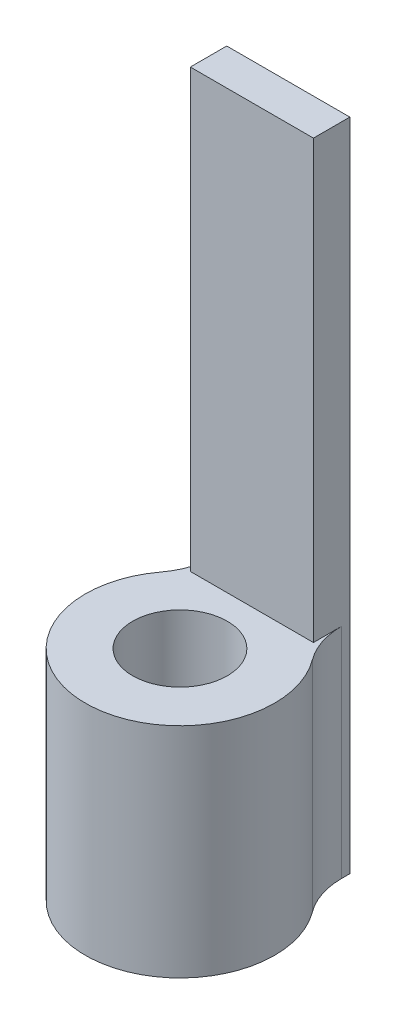
ISO-10303-21;
HEADER;
FILE_DESCRIPTION(('STEP AP214'),'2;1');
FILE_NAME('part.step','',(''),(''),'','','');
FILE_SCHEMA(('AUTOMOTIVE_DESIGN { 1 0 10303 214 1 1 1 1 }'));
ENDSEC;
DATA;
#1=APPLICATION_CONTEXT('core data for automotive mechanical design processes');
#2=APPLICATION_PROTOCOL_DEFINITION('international standard','automotive_design',2000,#1);
#3=PRODUCT_CONTEXT('',#1,'mechanical');
#4=PRODUCT('Part','Part','',(#3));
#5=PRODUCT_RELATED_PRODUCT_CATEGORY('part','',(#4));
#6=PRODUCT_DEFINITION_FORMATION('','',#4);
#7=PRODUCT_DEFINITION_CONTEXT('part definition',#1,'design');
#8=PRODUCT_DEFINITION('design','',#6,#7);
#9=PRODUCT_DEFINITION_SHAPE('','',#8);
#10=(LENGTH_UNIT() NAMED_UNIT(*) SI_UNIT(.MILLI.,.METRE.));
#11=(NAMED_UNIT(*) PLANE_ANGLE_UNIT() SI_UNIT($,.RADIAN.));
#12=(NAMED_UNIT(*) SI_UNIT($,.STERADIAN.) SOLID_ANGLE_UNIT());
#13=UNCERTAINTY_MEASURE_WITH_UNIT(LENGTH_MEASURE(1.E-05),#10,'distance_accuracy_value','');
#14=(GEOMETRIC_REPRESENTATION_CONTEXT(3) GLOBAL_UNCERTAINTY_ASSIGNED_CONTEXT((#13)) GLOBAL_UNIT_ASSIGNED_CONTEXT((#10,
#11,#12)) REPRESENTATION_CONTEXT('',''));
#15=CARTESIAN_POINT('',(0.,0.,0.));
#16=DIRECTION('',(0.,0.,1.));
#17=DIRECTION('',(1.,0.,0.));
#18=AXIS2_PLACEMENT_3D('',#15,#16,#17);
#19=CARTESIAN_POINT('',(0.,6.,0.));
#20=DIRECTION('',(0.,1.,0.));
#21=DIRECTION('',(0.,0.,1.));
#22=AXIS2_PLACEMENT_3D('',#19,#20,#21);
#23=PLANE('',#22);
#24=DIRECTION('',(-1.,0.,0.));
#25=VECTOR('',#24,1.);
#26=CARTESIAN_POINT('',(-1.6907683122634,6.,-1.97517151514647));
#27=LINE('',#26,#25);
#28=CARTESIAN_POINT('',(1.6907683122634,6.,-1.97517151514647));
#29=VERTEX_POINT('',#28);
#30=CARTESIAN_POINT('',(-1.6907683122634,6.,-1.97517151514647));
#31=VERTEX_POINT('',#30);
#32=EDGE_CURVE('E146',#29,#31,#27,.T.);
#33=ORIENTED_EDGE('',*,*,#32,.T.);
#34=DIRECTION('',(0.,0.,1.));
#35=VECTOR('',#34,1.);
#36=CARTESIAN_POINT('',(-1.6907683122634,6.,0.));
#37=LINE('',#36,#35);
#38=CARTESIAN_POINT('',(-1.6907683122634,6.,-2.74558359282547));
#39=VERTEX_POINT('',#38);
#40=EDGE_CURVE('E53',#39,#31,#37,.T.);
#41=ORIENTED_EDGE('',*,*,#40,.F.);
#42=CARTESIAN_POINT('',(-3.6907683122634,6.,-2.74558359282547));
#43=DIRECTION('',(0.,1.,0.));
#44=DIRECTION('',(0.,0.,1.));
#45=AXIS2_PLACEMENT_3D('',#42,#43,#44);
#46=CIRCLE('',#45,2.);
#47=CARTESIAN_POINT('',(-2.08608643736627,6.,-1.55185159594483));
#48=VERTEX_POINT('',#47);
#49=EDGE_CURVE('E11',#39,#48,#46,.F.);
#50=ORIENTED_EDGE('',*,*,#49,.T.);
#51=CARTESIAN_POINT('',(0.,6.,0.));
#52=DIRECTION('',(0.,1.,0.));
#53=DIRECTION('',(0.,0.,1.));
#54=AXIS2_PLACEMENT_3D('',#51,#52,#53);
#55=CIRCLE('',#54,2.6);
#56=CARTESIAN_POINT('',(2.08608643736627,6.,-1.55185159594483));
#57=VERTEX_POINT('',#56);
#58=EDGE_CURVE('E143',#48,#57,#55,.T.);
#59=ORIENTED_EDGE('',*,*,#58,.T.);
#60=CARTESIAN_POINT('',(3.6907683122634,6.,-2.74558359282547));
#61=DIRECTION('',(0.,1.,0.));
#62=DIRECTION('',(0.,0.,1.));
#63=AXIS2_PLACEMENT_3D('',#60,#61,#62);
#64=CIRCLE('',#63,2.);
#65=CARTESIAN_POINT('',(1.6907683122634,6.,-2.74558359282547));
#66=VERTEX_POINT('',#65);
#67=EDGE_CURVE('E164',#57,#66,#64,.F.);
#68=ORIENTED_EDGE('',*,*,#67,.T.);
#69=DIRECTION('',(0.,0.,-1.));
#70=VECTOR('',#69,1.);
#71=CARTESIAN_POINT('',(1.6907683122634,6.,0.));
#72=LINE('',#71,#70);
#73=EDGE_CURVE('E48',#29,#66,#72,.T.);
#74=ORIENTED_EDGE('',*,*,#73,.F.);
#75=EDGE_LOOP('',(#33,#41,#50,#59,#68,#74));
#76=FACE_BOUND('',#75,.T.);
#77=CARTESIAN_POINT('',(0.,6.,0.));
#78=DIRECTION('',(0.,1.,0.));
#79=DIRECTION('',(0.,0.,1.));
#80=AXIS2_PLACEMENT_3D('',#77,#78,#79);
#81=CIRCLE('',#80,1.3);
#82=CARTESIAN_POINT('',(0.,6.,1.3));
#83=VERTEX_POINT('',#82);
#84=EDGE_CURVE('E137',#83,#83,#81,.T.);
#85=ORIENTED_EDGE('',*,*,#84,.F.);
#86=EDGE_LOOP('',(#85));
#87=FACE_BOUND('',#86,.T.);
#88=ADVANCED_FACE('F33',(#76,#87),#23,.T.);
#89=CARTESIAN_POINT('',(0.,0.,0.));
#90=DIRECTION('',(0.,1.,0.));
#91=DIRECTION('',(0.,0.,1.));
#92=AXIS2_PLACEMENT_3D('',#89,#90,#91);
#93=PLANE('',#92);
#94=CARTESIAN_POINT('',(0.,0.,0.));
#95=DIRECTION('',(0.,1.,0.));
#96=DIRECTION('',(0.,0.,1.));
#97=AXIS2_PLACEMENT_3D('',#94,#95,#96);
#98=CIRCLE('',#97,2.6);
#99=CARTESIAN_POINT('',(-2.08608643736627,0.,-1.55185159594483));
#100=VERTEX_POINT('',#99);
#101=CARTESIAN_POINT('',(2.08608643736627,0.,-1.55185159594483));
#102=VERTEX_POINT('',#101);
#103=EDGE_CURVE('E140',#100,#102,#98,.T.);
#104=ORIENTED_EDGE('',*,*,#103,.F.);
#105=CARTESIAN_POINT('',(-3.6907683122634,0.,-2.74558359282547));
#106=DIRECTION('',(0.,1.,0.));
#107=DIRECTION('',(0.,0.,1.));
#108=AXIS2_PLACEMENT_3D('',#105,#106,#107);
#109=CIRCLE('',#108,2.);
#110=CARTESIAN_POINT('',(-1.6907683122634,0.,-2.74558359282547));
#111=VERTEX_POINT('',#110);
#112=EDGE_CURVE('E41',#100,#111,#109,.T.);
#113=ORIENTED_EDGE('',*,*,#112,.T.);
#114=DIRECTION('',(0.,0.,-1.));
#115=VECTOR('',#114,1.);
#116=CARTESIAN_POINT('',(-1.6907683122634,0.,-1.97517151514647));
#117=LINE('',#116,#115);
#118=CARTESIAN_POINT('',(-1.6907683122634,0.,-2.97517151514647));
#119=VERTEX_POINT('',#118);
#120=EDGE_CURVE('E129',#111,#119,#117,.T.);
#121=ORIENTED_EDGE('',*,*,#120,.T.);
#122=DIRECTION('',(1.,0.,0.));
#123=VECTOR('',#122,1.);
#124=CARTESIAN_POINT('',(-1.6907683122634,0.,-2.97517151514647));
#125=LINE('',#124,#123);
#126=CARTESIAN_POINT('',(1.6907683122634,0.,-2.97517151514647));
#127=VERTEX_POINT('',#126);
#128=EDGE_CURVE('E102',#119,#127,#125,.T.);
#129=ORIENTED_EDGE('',*,*,#128,.T.);
#130=DIRECTION('',(0.,0.,1.));
#131=VECTOR('',#130,1.);
#132=CARTESIAN_POINT('',(1.6907683122634,0.,-1.97517151514647));
#133=LINE('',#132,#131);
#134=CARTESIAN_POINT('',(1.6907683122634,0.,-2.74558359282547));
#135=VERTEX_POINT('',#134);
#136=EDGE_CURVE('E122',#127,#135,#133,.T.);
#137=ORIENTED_EDGE('',*,*,#136,.T.);
#138=CARTESIAN_POINT('',(3.6907683122634,0.,-2.74558359282547));
#139=DIRECTION('',(0.,1.,0.));
#140=DIRECTION('',(0.,0.,1.));
#141=AXIS2_PLACEMENT_3D('',#138,#139,#140);
#142=CIRCLE('',#141,2.);
#143=EDGE_CURVE('E162',#135,#102,#142,.T.);
#144=ORIENTED_EDGE('',*,*,#143,.T.);
#145=EDGE_LOOP('',(#104,#113,#121,#129,#137,#144));
#146=FACE_BOUND('',#145,.T.);
#147=CARTESIAN_POINT('',(0.,0.,0.));
#148=DIRECTION('',(0.,1.,0.));
#149=DIRECTION('',(0.,0.,1.));
#150=AXIS2_PLACEMENT_3D('',#147,#148,#149);
#151=CIRCLE('',#150,1.3);
#152=CARTESIAN_POINT('',(0.,0.,1.3));
#153=VERTEX_POINT('',#152);
#154=EDGE_CURVE('E133',#153,#153,#151,.T.);
#155=ORIENTED_EDGE('',*,*,#154,.T.);
#156=EDGE_LOOP('',(#155));
#157=FACE_BOUND('',#156,.T.);
#158=ADVANCED_FACE('F167',(#146,#157),#93,.F.);
#159=CARTESIAN_POINT('',(0.,6.,0.));
#160=DIRECTION('',(0.,-1.,0.));
#161=DIRECTION('',(0.,0.,-1.));
#162=AXIS2_PLACEMENT_3D('',#159,#160,#161);
#163=CYLINDRICAL_SURFACE('',#162,2.6);
#164=ORIENTED_EDGE('',*,*,#103,.T.);
#165=DIRECTION('',(0.,-1.,0.));
#166=VECTOR('',#165,1.);
#167=CARTESIAN_POINT('',(2.08608643736627,6.,-1.55185159594483));
#168=LINE('',#167,#166);
#169=EDGE_CURVE('E157',#102,#57,#168,.F.);
#170=ORIENTED_EDGE('',*,*,#169,.T.);
#171=ORIENTED_EDGE('',*,*,#58,.F.);
#172=DIRECTION('',(0.,-1.,0.));
#173=VECTOR('',#172,1.);
#174=CARTESIAN_POINT('',(-2.08608643736627,6.,-1.55185159594483));
#175=LINE('',#174,#173);
#176=EDGE_CURVE('E154',#48,#100,#175,.T.);
#177=ORIENTED_EDGE('',*,*,#176,.T.);
#178=EDGE_LOOP('',(#164,#170,#171,#177));
#179=FACE_BOUND('',#178,.T.);
#180=ADVANCED_FACE('F177',(#179),#163,.T.);
#181=CARTESIAN_POINT('',(0.,6.,0.));
#182=DIRECTION('',(0.,-1.,0.));
#183=DIRECTION('',(0.,0.,-1.));
#184=AXIS2_PLACEMENT_3D('',#181,#182,#183);
#185=CYLINDRICAL_SURFACE('',#184,1.3);
#186=ORIENTED_EDGE('',*,*,#84,.T.);
#187=EDGE_LOOP('',(#186));
#188=FACE_BOUND('',#187,.T.);
#189=ORIENTED_EDGE('',*,*,#154,.F.);
#190=EDGE_LOOP('',(#189));
#191=FACE_BOUND('',#190,.T.);
#192=ADVANCED_FACE('F197',(#188,#191),#185,.F.);
#193=CARTESIAN_POINT('',(-1.6907683122634,18.,-1.97517151514647));
#194=DIRECTION('',(-1.,0.,0.));
#195=DIRECTION('',(0.,0.,1.));
#196=AXIS2_PLACEMENT_3D('',#193,#194,#195);
#197=PLANE('',#196);
#198=ORIENTED_EDGE('',*,*,#120,.F.);
#199=DIRECTION('',(0.,-1.,0.));
#200=VECTOR('',#199,1.);
#201=CARTESIAN_POINT('',(-1.6907683122634,18.,-2.74558359282547));
#202=LINE('',#201,#200);
#203=EDGE_CURVE('E160',#111,#39,#202,.F.);
#204=ORIENTED_EDGE('',*,*,#203,.T.);
#205=ORIENTED_EDGE('',*,*,#40,.T.);
#206=DIRECTION('',(0.,-1.,0.));
#207=VECTOR('',#206,1.);
#208=CARTESIAN_POINT('',(-1.6907683122634,18.,-1.97517151514647));
#209=LINE('',#208,#207);
#210=CARTESIAN_POINT('',(-1.6907683122634,18.,-1.97517151514647));
#211=VERTEX_POINT('',#210);
#212=EDGE_CURVE('E121',#211,#31,#209,.T.);
#213=ORIENTED_EDGE('',*,*,#212,.F.);
#214=DIRECTION('',(0.,0.,-1.));
#215=VECTOR('',#214,1.);
#216=CARTESIAN_POINT('',(-1.6907683122634,18.,-1.97517151514647));
#217=LINE('',#216,#215);
#218=CARTESIAN_POINT('',(-1.6907683122634,18.,-2.97517151514647));
#219=VERTEX_POINT('',#218);
#220=EDGE_CURVE('E114',#211,#219,#217,.T.);
#221=ORIENTED_EDGE('',*,*,#220,.T.);
#222=DIRECTION('',(0.,-1.,0.));
#223=VECTOR('',#222,1.);
#224=CARTESIAN_POINT('',(-1.6907683122634,18.,-2.97517151514647));
#225=LINE('',#224,#223);
#226=EDGE_CURVE('E97',#219,#119,#225,.T.);
#227=ORIENTED_EDGE('',*,*,#226,.T.);
#228=EDGE_LOOP('',(#198,#204,#205,#213,#221,#227));
#229=FACE_BOUND('',#228,.T.);
#230=ADVANCED_FACE('F119',(#229),#197,.T.);
#231=CARTESIAN_POINT('',(-1.6907683122634,18.,-1.97517151514647));
#232=DIRECTION('',(0.,0.,1.));
#233=DIRECTION('',(1.,0.,0.));
#234=AXIS2_PLACEMENT_3D('',#231,#232,#233);
#235=PLANE('',#234);
#236=ORIENTED_EDGE('',*,*,#212,.T.);
#237=ORIENTED_EDGE('',*,*,#32,.F.);
#238=DIRECTION('',(0.,-1.,0.));
#239=VECTOR('',#238,1.);
#240=CARTESIAN_POINT('',(1.6907683122634,18.,-1.97517151514647));
#241=LINE('',#240,#239);
#242=CARTESIAN_POINT('',(1.6907683122634,18.,-1.97517151514647));
#243=VERTEX_POINT('',#242);
#244=EDGE_CURVE('E134',#243,#29,#241,.T.);
#245=ORIENTED_EDGE('',*,*,#244,.F.);
#246=DIRECTION('',(-1.,0.,0.));
#247=VECTOR('',#246,1.);
#248=CARTESIAN_POINT('',(-1.6907683122634,18.,-1.97517151514647));
#249=LINE('',#248,#247);
#250=EDGE_CURVE('E107',#243,#211,#249,.T.);
#251=ORIENTED_EDGE('',*,*,#250,.T.);
#252=EDGE_LOOP('',(#236,#237,#245,#251));
#253=FACE_BOUND('',#252,.T.);
#254=ADVANCED_FACE('F187',(#253),#235,.T.);
#255=CARTESIAN_POINT('',(1.6907683122634,18.,-1.97517151514647));
#256=DIRECTION('',(1.,0.,0.));
#257=DIRECTION('',(0.,0.,-1.));
#258=AXIS2_PLACEMENT_3D('',#255,#256,#257);
#259=PLANE('',#258);
#260=ORIENTED_EDGE('',*,*,#73,.T.);
#261=DIRECTION('',(0.,-1.,0.));
#262=VECTOR('',#261,1.);
#263=CARTESIAN_POINT('',(1.6907683122634,18.,-2.74558359282547));
#264=LINE('',#263,#262);
#265=EDGE_CURVE('E151',#66,#135,#264,.T.);
#266=ORIENTED_EDGE('',*,*,#265,.T.);
#267=ORIENTED_EDGE('',*,*,#136,.F.);
#268=DIRECTION('',(0.,-1.,0.));
#269=VECTOR('',#268,1.);
#270=CARTESIAN_POINT('',(1.6907683122634,18.,-2.97517151514647));
#271=LINE('',#270,#269);
#272=CARTESIAN_POINT('',(1.6907683122634,18.,-2.97517151514647));
#273=VERTEX_POINT('',#272);
#274=EDGE_CURVE('E106',#273,#127,#271,.T.);
#275=ORIENTED_EDGE('',*,*,#274,.F.);
#276=DIRECTION('',(0.,0.,1.));
#277=VECTOR('',#276,1.);
#278=CARTESIAN_POINT('',(1.6907683122634,18.,-1.97517151514647));
#279=LINE('',#278,#277);
#280=EDGE_CURVE('E117',#273,#243,#279,.T.);
#281=ORIENTED_EDGE('',*,*,#280,.T.);
#282=ORIENTED_EDGE('',*,*,#244,.T.);
#283=EDGE_LOOP('',(#260,#266,#267,#275,#281,#282));
#284=FACE_BOUND('',#283,.T.);
#285=ADVANCED_FACE('F183',(#284),#259,.T.);
#286=CARTESIAN_POINT('',(-1.6907683122634,18.,-2.97517151514647));
#287=DIRECTION('',(0.,0.,-1.));
#288=DIRECTION('',(-1.,0.,0.));
#289=AXIS2_PLACEMENT_3D('',#286,#287,#288);
#290=PLANE('',#289);
#291=ORIENTED_EDGE('',*,*,#128,.F.);
#292=ORIENTED_EDGE('',*,*,#226,.F.);
#293=DIRECTION('',(1.,0.,0.));
#294=VECTOR('',#293,1.);
#295=CARTESIAN_POINT('',(-1.6907683122634,18.,-2.97517151514647));
#296=LINE('',#295,#294);
#297=EDGE_CURVE('E100',#219,#273,#296,.T.);
#298=ORIENTED_EDGE('',*,*,#297,.T.);
#299=ORIENTED_EDGE('',*,*,#274,.T.);
#300=EDGE_LOOP('',(#291,#292,#298,#299));
#301=FACE_BOUND('',#300,.T.);
#302=ADVANCED_FACE('F99',(#301),#290,.T.);
#303=CARTESIAN_POINT('',(0.,18.,0.));
#304=DIRECTION('',(0.,-1.,0.));
#305=DIRECTION('',(0.,0.,-1.));
#306=AXIS2_PLACEMENT_3D('',#303,#304,#305);
#307=PLANE('',#306);
#308=ORIENTED_EDGE('',*,*,#220,.F.);
#309=ORIENTED_EDGE('',*,*,#250,.F.);
#310=ORIENTED_EDGE('',*,*,#280,.F.);
#311=ORIENTED_EDGE('',*,*,#297,.F.);
#312=EDGE_LOOP('',(#308,#309,#310,#311));
#313=FACE_BOUND('',#312,.T.);
#314=ADVANCED_FACE('F112',(#313),#307,.F.);
#315=CARTESIAN_POINT('',(3.6907683122634,6.,-2.74558359282547));
#316=DIRECTION('',(0.,-1.,0.));
#317=DIRECTION('',(0.,0.,-1.));
#318=AXIS2_PLACEMENT_3D('',#315,#316,#317);
#319=CYLINDRICAL_SURFACE('',#318,2.);
#320=ORIENTED_EDGE('',*,*,#67,.F.);
#321=ORIENTED_EDGE('',*,*,#169,.F.);
#322=ORIENTED_EDGE('',*,*,#143,.F.);
#323=ORIENTED_EDGE('',*,*,#265,.F.);
#324=EDGE_LOOP('',(#320,#321,#322,#323));
#325=FACE_BOUND('',#324,.T.);
#326=ADVANCED_FACE('F180',(#325),#319,.F.);
#327=CARTESIAN_POINT('',(-3.6907683122634,6.,-2.74558359282547));
#328=DIRECTION('',(0.,-1.,0.));
#329=DIRECTION('',(0.,0.,-1.));
#330=AXIS2_PLACEMENT_3D('',#327,#328,#329);
#331=CYLINDRICAL_SURFACE('',#330,2.);
#332=ORIENTED_EDGE('',*,*,#49,.F.);
#333=ORIENTED_EDGE('',*,*,#203,.F.);
#334=ORIENTED_EDGE('',*,*,#112,.F.);
#335=ORIENTED_EDGE('',*,*,#176,.F.);
#336=EDGE_LOOP('',(#332,#333,#334,#335));
#337=FACE_BOUND('',#336,.T.);
#338=ADVANCED_FACE('F35',(#337),#331,.F.);
#339=CLOSED_SHELL('',(#88,#158,#180,#192,#230,#254,#285,#302,#314,#326,#338));
#340=MANIFOLD_SOLID_BREP('B2',#339);
#341=ADVANCED_BREP_SHAPE_REPRESENTATION('',(#18,#340),#14);
#342=SHAPE_DEFINITION_REPRESENTATION(#9,#341);
ENDSEC;
END-ISO-10303-21;
